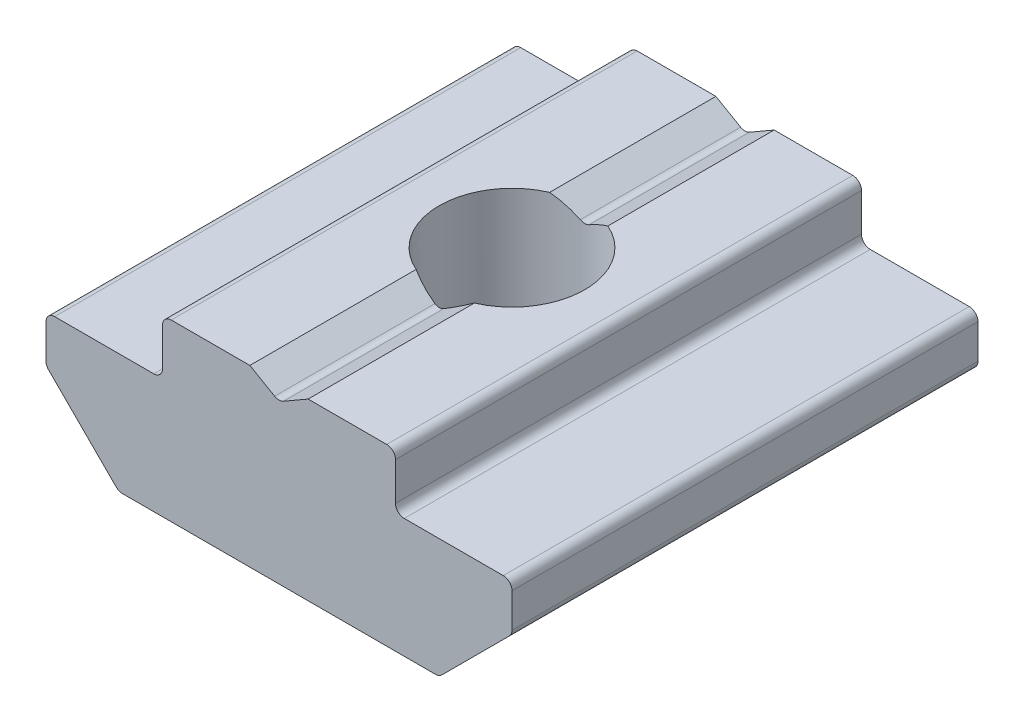
ISO-10303-21;
HEADER;
FILE_DESCRIPTION(('STEP AP214'),'2;1');
FILE_NAME('part.step','',(''),(''),'','','');
FILE_SCHEMA(('AUTOMOTIVE_DESIGN { 1 0 10303 214 1 1 1 1 }'));
ENDSEC;
DATA;
#1=APPLICATION_CONTEXT('core data for automotive mechanical design processes');
#2=APPLICATION_PROTOCOL_DEFINITION('international standard','automotive_design',2000,#1);
#3=PRODUCT_CONTEXT('',#1,'mechanical');
#4=PRODUCT('Part','Part','',(#3));
#5=PRODUCT_RELATED_PRODUCT_CATEGORY('part','',(#4));
#6=PRODUCT_DEFINITION_FORMATION('','',#4);
#7=PRODUCT_DEFINITION_CONTEXT('part definition',#1,'design');
#8=PRODUCT_DEFINITION('design','',#6,#7);
#9=PRODUCT_DEFINITION_SHAPE('','',#8);
#10=(LENGTH_UNIT() NAMED_UNIT(*) SI_UNIT(.MILLI.,.METRE.));
#11=(NAMED_UNIT(*) PLANE_ANGLE_UNIT() SI_UNIT($,.RADIAN.));
#12=(NAMED_UNIT(*) SI_UNIT($,.STERADIAN.) SOLID_ANGLE_UNIT());
#13=UNCERTAINTY_MEASURE_WITH_UNIT(LENGTH_MEASURE(1.E-05),#10,'distance_accuracy_value','');
#14=(GEOMETRIC_REPRESENTATION_CONTEXT(3) GLOBAL_UNCERTAINTY_ASSIGNED_CONTEXT((#13)) GLOBAL_UNIT_ASSIGNED_CONTEXT((#10,
#11,#12)) REPRESENTATION_CONTEXT('',''));
#15=CARTESIAN_POINT('',(0.,0.,0.));
#16=DIRECTION('',(0.,0.,1.));
#17=DIRECTION('',(1.,0.,0.));
#18=AXIS2_PLACEMENT_3D('',#15,#16,#17);
#19=CARTESIAN_POINT('',(0.25,-0.43301270189222,16.));
#20=DIRECTION('',(0.5,-0.866025403784439,0.));
#21=DIRECTION('',(0.866025403784439,0.5,0.));
#22=AXIS2_PLACEMENT_3D('',#19,#20,#21);
#23=PLANE('',#22);
#24=DIRECTION('',(0.,0.,-1.));
#25=VECTOR('',#24,1.);
#26=CARTESIAN_POINT('',(1.,0.,16.));
#27=LINE('',#26,#25);
#28=CARTESIAN_POINT('',(1.,0.,16.));
#29=VERTEX_POINT('',#28);
#30=CARTESIAN_POINT('',(1.,0.,10.2912878474779));
#31=VERTEX_POINT('',#30);
#32=EDGE_CURVE('E313',#29,#31,#27,.T.);
#33=ORIENTED_EDGE('',*,*,#32,.T.);
#34=CARTESIAN_POINT('',(0.,-0.577350269189625,8.));
#35=DIRECTION('',(0.5,-0.866025403784439,0.));
#36=DIRECTION('',(0.866025403784439,0.5,0.));
#37=AXIS2_PLACEMENT_3D('',#34,#35,#36);
#38=ELLIPSE('',#37,2.88675134594813,2.5);
#39=CARTESIAN_POINT('',(0.15,-0.490747728811182,10.4954959426936));
#40=VERTEX_POINT('',#39);
#41=EDGE_CURVE('E400',#31,#40,#38,.T.);
#42=ORIENTED_EDGE('',*,*,#41,.T.);
#43=DIRECTION('',(0.,0.,-1.));
#44=VECTOR('',#43,1.);
#45=CARTESIAN_POINT('',(0.15,-0.490747728811182,16.));
#46=LINE('',#45,#44);
#47=CARTESIAN_POINT('',(0.15,-0.490747728811182,16.));
#48=VERTEX_POINT('',#47);
#49=EDGE_CURVE('E309',#48,#40,#46,.T.);
#50=ORIENTED_EDGE('',*,*,#49,.F.);
#51=DIRECTION('',(-0.866025403784439,-0.5,0.));
#52=VECTOR('',#51,1.);
#53=CARTESIAN_POINT('',(0.25,-0.43301270189222,16.));
#54=LINE('',#53,#52);
#55=EDGE_CURVE('E493',#29,#48,#54,.T.);
#56=ORIENTED_EDGE('',*,*,#55,.F.);
#57=EDGE_LOOP('',(#33,#42,#50,#56));
#58=FACE_BOUND('',#57,.T.);
#59=ADVANCED_FACE('F35',(#58),#23,.F.);
#60=CARTESIAN_POINT('',(0.,-0.23094010767585,16.));
#61=DIRECTION('',(0.,0.,1.));
#62=DIRECTION('',(0.866025403784439,0.5,0.));
#63=AXIS2_PLACEMENT_3D('',#60,#61,#62);
#64=ELLIPSE('',#63,0.300000000000001,0.3);
#65=DIRECTION('',(0.,0.,-1.));
#66=VECTOR('',#65,1.);
#67=SURFACE_OF_LINEAR_EXTRUSION('',#64,#66);
#68=CARTESIAN_POINT('',(0.15,-0.490747728811182,5.50450405730644));
#69=CARTESIAN_POINT('',(0.13568202883733,-0.499029869843911,5.50363835015334));
#70=CARTESIAN_POINT('',(0.120664490923634,-0.50610581903908,5.50286410246527));
#71=CARTESIAN_POINT('',(0.0896672896524015,-0.517700141764689,5.50156180177861));
#72=CARTESIAN_POINT('',(0.0736879123354807,-0.522219271548495,5.50103367599049));
#73=CARTESIAN_POINT('',(0.0412336376802456,-0.528552305885176,5.50028719530378));
#74=CARTESIAN_POINT('',(0.0247600072751891,-0.53037260957326,5.50006810771079));
#75=CARTESIAN_POINT('',(-0.00825823741791211,-0.531280639221926,5.4999591232102));
#76=CARTESIAN_POINT('',(-0.0248028230360078,-0.530369380932977,5.5000691039362));
#77=CARTESIAN_POINT('',(-0.0575073690391814,-0.525838212461767,5.50060843873768));
#78=CARTESIAN_POINT('',(-0.0736673333398581,-0.522218329866565,5.5010377895604));
#79=CARTESIAN_POINT('',(-0.110506856511238,-0.510724691600204,5.50235188429175));
#80=CARTESIAN_POINT('',(-0.130867555440053,-0.501826590966825,5.50334150814386));
#81=CARTESIAN_POINT('',(-0.149999999999997,-0.490747728811184,5.50450405730644));
#82=B_SPLINE_CURVE_WITH_KNOTS('',3,(#68,#69,#70,#71,#72,#73,#74,#75,#76,#77,#78,#79,#80,#81),
.UNSPECIFIED.,.F.,.F.,(4,2,2,2,2,2,4),(0.,0.0496299671329606,0.0992452470817413,
0.14874269599097,0.198221741210452,0.247700282497827,0.313904918598475),.UNSPECIFIED.);
#83=CARTESIAN_POINT('',(0.15,-0.490747728811182,5.50450405730644));
#84=VERTEX_POINT('',#83);
#85=CARTESIAN_POINT('',(-0.150000000000001,-0.490747728811182,5.50450405730644));
#86=VERTEX_POINT('',#85);
#87=EDGE_CURVE('E398',#84,#86,#82,.T.);
#88=ORIENTED_EDGE('',*,*,#87,.F.);
#89=CARTESIAN_POINT('',(0.15,-0.490747728811182,0.));
#90=VERTEX_POINT('',#89);
#91=EDGE_CURVE('E308',#84,#90,#46,.T.);
#92=ORIENTED_EDGE('',*,*,#91,.T.);
#93=CARTESIAN_POINT('',(0.,-0.23094010767585,0.));
#94=DIRECTION('',(0.,0.,1.));
#95=DIRECTION('',(0.866025403784439,0.5,0.));
#96=AXIS2_PLACEMENT_3D('',#93,#94,#95);
#97=ELLIPSE('',#96,0.300000000000001,0.3);
#98=CARTESIAN_POINT('',(-0.150000000000001,-0.490747728811182,0.));
#99=VERTEX_POINT('',#98);
#100=EDGE_CURVE('E357',#99,#90,#97,.T.);
#101=ORIENTED_EDGE('',*,*,#100,.F.);
#102=DIRECTION('',(0.,0.,-1.));
#103=VECTOR('',#102,1.);
#104=CARTESIAN_POINT('',(-0.150000000000001,-0.490747728811182,16.));
#105=LINE('',#104,#103);
#106=EDGE_CURVE('E304',#86,#99,#105,.T.);
#107=ORIENTED_EDGE('',*,*,#106,.F.);
#108=EDGE_LOOP('',(#88,#92,#101,#107));
#109=FACE_BOUND('',#108,.T.);
#110=ADVANCED_FACE('F484',(#109),#67,.T.);
#111=CARTESIAN_POINT('',(-0.250000000000001,-0.43301270189222,16.));
#112=DIRECTION('',(-0.500000000000001,-0.866025403784438,0.));
#113=DIRECTION('',(0.866025403784438,-0.500000000000001,0.));
#114=AXIS2_PLACEMENT_3D('',#111,#112,#113);
#115=PLANE('',#114);
#116=DIRECTION('',(0.,0.,-1.));
#117=VECTOR('',#116,1.);
#118=CARTESIAN_POINT('',(-0.999999999999999,0.,16.));
#119=LINE('',#118,#117);
#120=CARTESIAN_POINT('',(-0.999999999999999,0.,5.70871215252208));
#121=VERTEX_POINT('',#120);
#122=CARTESIAN_POINT('',(-0.999999999999999,0.,0.));
#123=VERTEX_POINT('',#122);
#124=EDGE_CURVE('E300',#121,#123,#119,.T.);
#125=ORIENTED_EDGE('',*,*,#124,.F.);
#126=CARTESIAN_POINT('',(0.,-0.577350269189628,8.));
#127=DIRECTION('',(-0.500000000000001,-0.866025403784438,0.));
#128=DIRECTION('',(-0.866025403784438,0.500000000000001,0.));
#129=AXIS2_PLACEMENT_3D('',#126,#127,#128);
#130=ELLIPSE('',#129,2.88675134594813,2.5);
#131=EDGE_CURVE('E50',#121,#86,#130,.T.);
#132=ORIENTED_EDGE('',*,*,#131,.T.);
#133=ORIENTED_EDGE('',*,*,#106,.T.);
#134=DIRECTION('',(-0.866025403784438,0.500000000000001,0.));
#135=VECTOR('',#134,1.);
#136=CARTESIAN_POINT('',(-0.250000000000001,-0.43301270189222,0.));
#137=LINE('',#136,#135);
#138=EDGE_CURVE('E360',#99,#123,#137,.T.);
#139=ORIENTED_EDGE('',*,*,#138,.T.);
#140=EDGE_LOOP('',(#125,#132,#133,#139));
#141=FACE_BOUND('',#140,.T.);
#142=ADVANCED_FACE('F489',(#141),#115,.F.);
#143=CARTESIAN_POINT('',(8.,0.,16.));
#144=DIRECTION('',(1.,0.,0.));
#145=DIRECTION('',(0.,0.,-1.));
#146=AXIS2_PLACEMENT_3D('',#143,#144,#145);
#147=PLANE('',#146);
#148=DIRECTION('',(0.,-1.,0.));
#149=VECTOR('',#148,1.);
#150=CARTESIAN_POINT('',(8.,0.,0.));
#151=LINE('',#150,#149);
#152=CARTESIAN_POINT('',(8.,-2.2,0.));
#153=VERTEX_POINT('',#152);
#154=CARTESIAN_POINT('',(8.,-3.37573593128807,0.));
#155=VERTEX_POINT('',#154);
#156=EDGE_CURVE('E237',#153,#155,#151,.T.);
#157=ORIENTED_EDGE('',*,*,#156,.F.);
#158=DIRECTION('',(0.,0.,-1.));
#159=VECTOR('',#158,1.);
#160=CARTESIAN_POINT('',(8.,-2.2,16.));
#161=LINE('',#160,#159);
#162=CARTESIAN_POINT('',(8.,-2.2,16.));
#163=VERTEX_POINT('',#162);
#164=EDGE_CURVE('E11',#163,#153,#161,.T.);
#165=ORIENTED_EDGE('',*,*,#164,.F.);
#166=DIRECTION('',(0.,-1.,0.));
#167=VECTOR('',#166,1.);
#168=CARTESIAN_POINT('',(8.,0.,16.));
#169=LINE('',#168,#167);
#170=CARTESIAN_POINT('',(8.,-3.37573593128807,16.));
#171=VERTEX_POINT('',#170);
#172=EDGE_CURVE('E394',#163,#171,#169,.T.);
#173=ORIENTED_EDGE('',*,*,#172,.T.);
#174=DIRECTION('',(0.,0.,-1.));
#175=VECTOR('',#174,1.);
#176=CARTESIAN_POINT('',(8.,-3.37573593128807,16.));
#177=LINE('',#176,#175);
#178=EDGE_CURVE('E140',#171,#155,#177,.T.);
#179=ORIENTED_EDGE('',*,*,#178,.T.);
#180=EDGE_LOOP('',(#157,#165,#173,#179));
#181=FACE_BOUND('',#180,.T.);
#182=ADVANCED_FACE('F37',(#181),#147,.T.);
#183=CARTESIAN_POINT('',(7.7,-2.2,16.));
#184=DIRECTION('',(0.,0.,1.));
#185=DIRECTION('',(1.,0.,0.));
#186=AXIS2_PLACEMENT_3D('',#183,#184,#185);
#187=ELLIPSE('',#186,0.299999999999999,0.299999999999999);
#188=DIRECTION('',(0.,0.,-1.));
#189=VECTOR('',#188,1.);
#190=SURFACE_OF_LINEAR_EXTRUSION('',#187,#189);
#191=CARTESIAN_POINT('',(7.7,-2.2,0.));
#192=DIRECTION('',(0.,0.,1.));
#193=DIRECTION('',(1.,0.,0.));
#194=AXIS2_PLACEMENT_3D('',#191,#192,#193);
#195=ELLIPSE('',#194,0.299999999999999,0.299999999999999);
#196=CARTESIAN_POINT('',(7.7,-1.9,0.));
#197=VERTEX_POINT('',#196);
#198=EDGE_CURVE('E336',#153,#197,#195,.T.);
#199=ORIENTED_EDGE('',*,*,#198,.T.);
#200=DIRECTION('',(0.,0.,-1.));
#201=VECTOR('',#200,1.);
#202=CARTESIAN_POINT('',(7.7,-1.9,16.));
#203=LINE('',#202,#201);
#204=CARTESIAN_POINT('',(7.7,-1.9,16.));
#205=VERTEX_POINT('',#204);
#206=EDGE_CURVE('E43',#205,#197,#203,.T.);
#207=ORIENTED_EDGE('',*,*,#206,.F.);
#208=EDGE_CURVE('E444',#163,#205,#187,.T.);
#209=ORIENTED_EDGE('',*,*,#208,.F.);
#210=ORIENTED_EDGE('',*,*,#164,.T.);
#211=EDGE_LOOP('',(#199,#207,#209,#210));
#212=FACE_BOUND('',#211,.T.);
#213=ADVANCED_FACE('F337',(#212),#190,.F.);
#214=CARTESIAN_POINT('',(0.,-1.9,16.));
#215=DIRECTION('',(0.,1.,0.));
#216=DIRECTION('',(-1.,0.,0.));
#217=AXIS2_PLACEMENT_3D('',#214,#215,#216);
#218=PLANE('',#217);
#219=DIRECTION('',(1.,0.,0.));
#220=VECTOR('',#219,1.);
#221=CARTESIAN_POINT('',(0.,-1.9,0.));
#222=LINE('',#221,#220);
#223=CARTESIAN_POINT('',(4.3,-1.9,0.));
#224=VERTEX_POINT('',#223);
#225=EDGE_CURVE('E330',#224,#197,#222,.T.);
#226=ORIENTED_EDGE('',*,*,#225,.F.);
#227=DIRECTION('',(0.,0.,-1.));
#228=VECTOR('',#227,1.);
#229=CARTESIAN_POINT('',(4.3,-1.9,16.));
#230=LINE('',#229,#228);
#231=CARTESIAN_POINT('',(4.3,-1.9,16.));
#232=VERTEX_POINT('',#231);
#233=EDGE_CURVE('E322',#232,#224,#230,.T.);
#234=ORIENTED_EDGE('',*,*,#233,.F.);
#235=DIRECTION('',(1.,0.,0.));
#236=VECTOR('',#235,1.);
#237=CARTESIAN_POINT('',(0.,-1.9,16.));
#238=LINE('',#237,#236);
#239=EDGE_CURVE('E333',#232,#205,#238,.T.);
#240=ORIENTED_EDGE('',*,*,#239,.T.);
#241=ORIENTED_EDGE('',*,*,#206,.T.);
#242=EDGE_LOOP('',(#226,#234,#240,#241));
#243=FACE_BOUND('',#242,.T.);
#244=ADVANCED_FACE('F328',(#243),#218,.T.);
#245=CARTESIAN_POINT('',(4.3,-1.6,16.));
#246=DIRECTION('',(0.,0.,1.));
#247=DIRECTION('',(0.,1.,0.));
#248=AXIS2_PLACEMENT_3D('',#245,#246,#247);
#249=ELLIPSE('',#248,0.299999999999999,0.299999999999999);
#250=DIRECTION('',(0.,0.,-1.));
#251=VECTOR('',#250,1.);
#252=SURFACE_OF_LINEAR_EXTRUSION('',#249,#251);
#253=CARTESIAN_POINT('',(4.3,-1.6,0.));
#254=DIRECTION('',(0.,0.,1.));
#255=DIRECTION('',(0.,1.,0.));
#256=AXIS2_PLACEMENT_3D('',#253,#254,#255);
#257=ELLIPSE('',#256,0.299999999999999,0.299999999999999);
#258=CARTESIAN_POINT('',(4.,-1.6,0.));
#259=VERTEX_POINT('',#258);
#260=EDGE_CURVE('E342',#259,#224,#257,.T.);
#261=ORIENTED_EDGE('',*,*,#260,.F.);
#262=DIRECTION('',(0.,0.,-1.));
#263=VECTOR('',#262,1.);
#264=CARTESIAN_POINT('',(4.,-1.6,16.));
#265=LINE('',#264,#263);
#266=CARTESIAN_POINT('',(4.,-1.6,16.));
#267=VERTEX_POINT('',#266);
#268=EDGE_CURVE('E320',#267,#259,#265,.T.);
#269=ORIENTED_EDGE('',*,*,#268,.F.);
#270=EDGE_CURVE('E458',#267,#232,#249,.T.);
#271=ORIENTED_EDGE('',*,*,#270,.T.);
#272=ORIENTED_EDGE('',*,*,#233,.T.);
#273=EDGE_LOOP('',(#261,#269,#271,#272));
#274=FACE_BOUND('',#273,.T.);
#275=ADVANCED_FACE('F452',(#274),#252,.T.);
#276=CARTESIAN_POINT('',(4.,0.,16.));
#277=DIRECTION('',(1.,0.,0.));
#278=DIRECTION('',(0.,0.,-1.));
#279=AXIS2_PLACEMENT_3D('',#276,#277,#278);
#280=PLANE('',#279);
#281=DIRECTION('',(0.,-1.,0.));
#282=VECTOR('',#281,1.);
#283=CARTESIAN_POINT('',(4.,0.,0.));
#284=LINE('',#283,#282);
#285=CARTESIAN_POINT('',(4.,-0.3,0.));
#286=VERTEX_POINT('',#285);
#287=EDGE_CURVE('E344',#286,#259,#284,.T.);
#288=ORIENTED_EDGE('',*,*,#287,.F.);
#289=DIRECTION('',(0.,0.,-1.));
#290=VECTOR('',#289,1.);
#291=CARTESIAN_POINT('',(4.,-0.3,16.));
#292=LINE('',#291,#290);
#293=CARTESIAN_POINT('',(4.,-0.3,16.));
#294=VERTEX_POINT('',#293);
#295=EDGE_CURVE('E318',#294,#286,#292,.T.);
#296=ORIENTED_EDGE('',*,*,#295,.F.);
#297=DIRECTION('',(0.,-1.,0.));
#298=VECTOR('',#297,1.);
#299=CARTESIAN_POINT('',(4.,0.,16.));
#300=LINE('',#299,#298);
#301=EDGE_CURVE('E462',#294,#267,#300,.T.);
#302=ORIENTED_EDGE('',*,*,#301,.T.);
#303=ORIENTED_EDGE('',*,*,#268,.T.);
#304=EDGE_LOOP('',(#288,#296,#302,#303));
#305=FACE_BOUND('',#304,.T.);
#306=ADVANCED_FACE('F455',(#305),#280,.T.);
#307=CARTESIAN_POINT('',(3.7,-0.299999999999999,16.));
#308=DIRECTION('',(0.,0.,1.));
#309=DIRECTION('',(1.,0.,0.));
#310=AXIS2_PLACEMENT_3D('',#307,#308,#309);
#311=ELLIPSE('',#310,0.299999999999999,0.299999999999999);
#312=DIRECTION('',(0.,0.,-1.));
#313=VECTOR('',#312,1.);
#314=SURFACE_OF_LINEAR_EXTRUSION('',#311,#313);
#315=CARTESIAN_POINT('',(3.7,-0.299999999999999,0.));
#316=DIRECTION('',(0.,0.,1.));
#317=DIRECTION('',(1.,0.,0.));
#318=AXIS2_PLACEMENT_3D('',#315,#316,#317);
#319=ELLIPSE('',#318,0.299999999999999,0.299999999999999);
#320=CARTESIAN_POINT('',(3.7,0.,0.));
#321=VERTEX_POINT('',#320);
#322=EDGE_CURVE('E348',#286,#321,#319,.T.);
#323=ORIENTED_EDGE('',*,*,#322,.T.);
#324=DIRECTION('',(0.,0.,-1.));
#325=VECTOR('',#324,1.);
#326=CARTESIAN_POINT('',(3.7,0.,16.));
#327=LINE('',#326,#325);
#328=CARTESIAN_POINT('',(3.7,0.,16.));
#329=VERTEX_POINT('',#328);
#330=EDGE_CURVE('E316',#329,#321,#327,.T.);
#331=ORIENTED_EDGE('',*,*,#330,.F.);
#332=EDGE_CURVE('E465',#294,#329,#311,.T.);
#333=ORIENTED_EDGE('',*,*,#332,.F.);
#334=ORIENTED_EDGE('',*,*,#295,.T.);
#335=EDGE_LOOP('',(#323,#331,#333,#334));
#336=FACE_BOUND('',#335,.T.);
#337=ADVANCED_FACE('F470',(#336),#314,.F.);
#338=CARTESIAN_POINT('',(0.,0.,16.));
#339=DIRECTION('',(0.,1.,0.));
#340=DIRECTION('',(-1.,0.,0.));
#341=AXIS2_PLACEMENT_3D('',#338,#339,#340);
#342=PLANE('',#341);
#343=CARTESIAN_POINT('',(0.,0.,8.));
#344=DIRECTION('',(0.,1.,0.));
#345=DIRECTION('',(-1.,0.,0.));
#346=AXIS2_PLACEMENT_3D('',#343,#344,#345);
#347=CIRCLE('',#346,2.5);
#348=CARTESIAN_POINT('',(1.,0.,5.70871215252208));
#349=VERTEX_POINT('',#348);
#350=EDGE_CURVE('E500',#31,#349,#347,.T.);
#351=ORIENTED_EDGE('',*,*,#350,.F.);
#352=ORIENTED_EDGE('',*,*,#32,.F.);
#353=DIRECTION('',(1.,0.,0.));
#354=VECTOR('',#353,1.);
#355=CARTESIAN_POINT('',(0.,0.,16.));
#356=LINE('',#355,#354);
#357=EDGE_CURVE('E468',#29,#329,#356,.T.);
#358=ORIENTED_EDGE('',*,*,#357,.T.);
#359=ORIENTED_EDGE('',*,*,#330,.T.);
#360=DIRECTION('',(1.,0.,0.));
#361=VECTOR('',#360,1.);
#362=CARTESIAN_POINT('',(0.,0.,0.));
#363=LINE('',#362,#361);
#364=CARTESIAN_POINT('',(1.,0.,0.));
#365=VERTEX_POINT('',#364);
#366=EDGE_CURVE('E351',#365,#321,#363,.T.);
#367=ORIENTED_EDGE('',*,*,#366,.F.);
#368=EDGE_CURVE('E312',#349,#365,#27,.T.);
#369=ORIENTED_EDGE('',*,*,#368,.F.);
#370=EDGE_LOOP('',(#351,#352,#358,#359,#367,#369));
#371=FACE_BOUND('',#370,.T.);
#372=ADVANCED_FACE('F473',(#371),#342,.T.);
#373=ORIENTED_EDGE('',*,*,#91,.F.);
#374=EDGE_CURVE('E396',#84,#349,#38,.T.);
#375=ORIENTED_EDGE('',*,*,#374,.T.);
#376=ORIENTED_EDGE('',*,*,#368,.T.);
#377=DIRECTION('',(-0.866025403784439,-0.5,0.));
#378=VECTOR('',#377,1.);
#379=CARTESIAN_POINT('',(0.25,-0.43301270189222,0.));
#380=LINE('',#379,#378);
#381=EDGE_CURVE('E354',#365,#90,#380,.T.);
#382=ORIENTED_EDGE('',*,*,#381,.T.);
#383=EDGE_LOOP('',(#373,#375,#376,#382));
#384=FACE_BOUND('',#383,.T.);
#385=ADVANCED_FACE('F476',(#384),#23,.F.);
#386=CARTESIAN_POINT('',(-0.150000000000001,-0.490747728811182,10.4954959426936));
#387=CARTESIAN_POINT('',(-0.135682028837331,-0.499029869843911,10.4963616498467));
#388=CARTESIAN_POINT('',(-0.120664490923635,-0.50610581903908,10.4971358975347));
#389=CARTESIAN_POINT('',(-0.0896672896524024,-0.517700141764689,10.4984381982214));
#390=CARTESIAN_POINT('',(-0.0736879123354816,-0.522219271548495,10.4989663240095));
#391=CARTESIAN_POINT('',(-0.0412336376802464,-0.528552305885176,10.4997128046962));
#392=CARTESIAN_POINT('',(-0.0247600072751899,-0.53037260957326,10.4999318922892));
#393=CARTESIAN_POINT('',(0.00825823741791129,-0.531280639221926,10.5000408767898));
#394=CARTESIAN_POINT('',(0.024802823036007,-0.530369380932977,10.4999308960638));
#395=CARTESIAN_POINT('',(0.0575073690391806,-0.525838212461767,10.4993915612623));
#396=CARTESIAN_POINT('',(0.0736673333398574,-0.522218329866565,10.4989622104396));
#397=CARTESIAN_POINT('',(0.110506856511238,-0.510724691600204,10.4976481157082));
#398=CARTESIAN_POINT('',(0.130867555440052,-0.501826590966825,10.4966584918561));
#399=CARTESIAN_POINT('',(0.149999999999997,-0.490747728811184,10.4954959426936));
#400=B_SPLINE_CURVE_WITH_KNOTS('',3,(#386,#387,#388,#389,#390,#391,#392,#393,#394,#395,#396,
#397,#398,#399),.UNSPECIFIED.,.F.,.F.,(4,2,2,2,2,2,4),(0.,0.0496299671329606,0.0992452470817415,
0.14874269599097,0.198221741210452,0.247700282497827,0.313904918598476),.UNSPECIFIED.);
#401=CARTESIAN_POINT('',(-0.150000000000001,-0.490747728811182,10.4954959426936));
#402=VERTEX_POINT('',#401);
#403=EDGE_CURVE('E409',#402,#40,#400,.T.);
#404=ORIENTED_EDGE('',*,*,#403,.F.);
#405=CARTESIAN_POINT('',(-0.150000000000001,-0.490747728811182,16.));
#406=VERTEX_POINT('',#405);
#407=EDGE_CURVE('E305',#406,#402,#105,.T.);
#408=ORIENTED_EDGE('',*,*,#407,.F.);
#409=EDGE_CURVE('E522',#406,#48,#64,.T.);
#410=ORIENTED_EDGE('',*,*,#409,.T.);
#411=ORIENTED_EDGE('',*,*,#49,.T.);
#412=EDGE_LOOP('',(#404,#408,#410,#411));
#413=FACE_BOUND('',#412,.T.);
#414=ADVANCED_FACE('F428',(#413),#67,.T.);
#415=ORIENTED_EDGE('',*,*,#407,.T.);
#416=CARTESIAN_POINT('',(-0.999999999999999,0.,10.2912878474779));
#417=VERTEX_POINT('',#416);
#418=EDGE_CURVE('E415',#402,#417,#130,.T.);
#419=ORIENTED_EDGE('',*,*,#418,.T.);
#420=CARTESIAN_POINT('',(-0.999999999999999,0.,16.));
#421=VERTEX_POINT('',#420);
#422=EDGE_CURVE('E301',#421,#417,#119,.T.);
#423=ORIENTED_EDGE('',*,*,#422,.F.);
#424=DIRECTION('',(-0.866025403784438,0.500000000000001,0.));
#425=VECTOR('',#424,1.);
#426=CARTESIAN_POINT('',(-0.250000000000001,-0.43301270189222,16.));
#427=LINE('',#426,#425);
#428=EDGE_CURVE('E518',#406,#421,#427,.T.);
#429=ORIENTED_EDGE('',*,*,#428,.F.);
#430=EDGE_LOOP('',(#415,#419,#423,#429));
#431=FACE_BOUND('',#430,.T.);
#432=ADVANCED_FACE('F482',(#431),#115,.F.);
#433=CARTESIAN_POINT('',(0.,0.,16.));
#434=DIRECTION('',(0.,-1.,0.));
#435=DIRECTION('',(1.,0.,0.));
#436=AXIS2_PLACEMENT_3D('',#433,#434,#435);
#437=PLANE('',#436);
#438=ORIENTED_EDGE('',*,*,#422,.T.);
#439=EDGE_CURVE('E502',#121,#417,#347,.T.);
#440=ORIENTED_EDGE('',*,*,#439,.F.);
#441=ORIENTED_EDGE('',*,*,#124,.T.);
#442=DIRECTION('',(-1.,0.,0.));
#443=VECTOR('',#442,1.);
#444=CARTESIAN_POINT('',(0.,0.,0.));
#445=LINE('',#444,#443);
#446=CARTESIAN_POINT('',(-3.7,0.,0.));
#447=VERTEX_POINT('',#446);
#448=EDGE_CURVE('E363',#123,#447,#445,.T.);
#449=ORIENTED_EDGE('',*,*,#448,.T.);
#450=DIRECTION('',(0.,0.,-1.));
#451=VECTOR('',#450,1.);
#452=CARTESIAN_POINT('',(-3.7,0.,16.));
#453=LINE('',#452,#451);
#454=CARTESIAN_POINT('',(-3.7,0.,16.));
#455=VERTEX_POINT('',#454);
#456=EDGE_CURVE('E297',#455,#447,#453,.T.);
#457=ORIENTED_EDGE('',*,*,#456,.F.);
#458=DIRECTION('',(-1.,0.,0.));
#459=VECTOR('',#458,1.);
#460=CARTESIAN_POINT('',(0.,0.,16.));
#461=LINE('',#460,#459);
#462=EDGE_CURVE('E515',#421,#455,#461,.T.);
#463=ORIENTED_EDGE('',*,*,#462,.F.);
#464=EDGE_LOOP('',(#438,#440,#441,#449,#457,#463));
#465=FACE_BOUND('',#464,.T.);
#466=ADVANCED_FACE('F513',(#465),#437,.F.);
#467=CARTESIAN_POINT('',(-3.7,-0.299999999999999,16.));
#468=DIRECTION('',(0.,0.,1.));
#469=DIRECTION('',(-1.,0.,0.));
#470=AXIS2_PLACEMENT_3D('',#467,#468,#469);
#471=ELLIPSE('',#470,0.299999999999999,0.299999999999999);
#472=DIRECTION('',(0.,0.,-1.));
#473=VECTOR('',#472,1.);
#474=SURFACE_OF_LINEAR_EXTRUSION('',#471,#473);
#475=CARTESIAN_POINT('',(-3.7,-0.299999999999999,0.));
#476=DIRECTION('',(0.,0.,1.));
#477=DIRECTION('',(-1.,0.,0.));
#478=AXIS2_PLACEMENT_3D('',#475,#476,#477);
#479=ELLIPSE('',#478,0.299999999999999,0.299999999999999);
#480=CARTESIAN_POINT('',(-4.,-0.3,0.));
#481=VERTEX_POINT('',#480);
#482=EDGE_CURVE('E365',#447,#481,#479,.T.);
#483=ORIENTED_EDGE('',*,*,#482,.T.);
#484=DIRECTION('',(0.,0.,-1.));
#485=VECTOR('',#484,1.);
#486=CARTESIAN_POINT('',(-4.,-0.3,16.));
#487=LINE('',#486,#485);
#488=CARTESIAN_POINT('',(-4.,-0.3,16.));
#489=VERTEX_POINT('',#488);
#490=EDGE_CURVE('E294',#489,#481,#487,.T.);
#491=ORIENTED_EDGE('',*,*,#490,.F.);
#492=EDGE_CURVE('E517',#455,#489,#471,.T.);
#493=ORIENTED_EDGE('',*,*,#492,.F.);
#494=ORIENTED_EDGE('',*,*,#456,.T.);
#495=EDGE_LOOP('',(#483,#491,#493,#494));
#496=FACE_BOUND('',#495,.T.);
#497=ADVANCED_FACE('F528',(#496),#474,.F.);
#498=CARTESIAN_POINT('',(-4.,0.,16.));
#499=DIRECTION('',(1.,0.,0.));
#500=DIRECTION('',(0.,0.,-1.));
#501=AXIS2_PLACEMENT_3D('',#498,#499,#500);
#502=PLANE('',#501);
#503=DIRECTION('',(0.,-1.,0.));
#504=VECTOR('',#503,1.);
#505=CARTESIAN_POINT('',(-4.,0.,0.));
#506=LINE('',#505,#504);
#507=CARTESIAN_POINT('',(-4.,-1.6,0.));
#508=VERTEX_POINT('',#507);
#509=EDGE_CURVE('E367',#481,#508,#506,.T.);
#510=ORIENTED_EDGE('',*,*,#509,.T.);
#511=DIRECTION('',(0.,0.,-1.));
#512=VECTOR('',#511,1.);
#513=CARTESIAN_POINT('',(-4.,-1.6,16.));
#514=LINE('',#513,#512);
#515=CARTESIAN_POINT('',(-4.,-1.6,16.));
#516=VERTEX_POINT('',#515);
#517=EDGE_CURVE('E292',#516,#508,#514,.T.);
#518=ORIENTED_EDGE('',*,*,#517,.F.);
#519=DIRECTION('',(0.,-1.,0.));
#520=VECTOR('',#519,1.);
#521=CARTESIAN_POINT('',(-4.,0.,16.));
#522=LINE('',#521,#520);
#523=EDGE_CURVE('E520',#489,#516,#522,.T.);
#524=ORIENTED_EDGE('',*,*,#523,.F.);
#525=ORIENTED_EDGE('',*,*,#490,.T.);
#526=EDGE_LOOP('',(#510,#518,#524,#525));
#527=FACE_BOUND('',#526,.T.);
#528=ADVANCED_FACE('F532',(#527),#502,.F.);
#529=CARTESIAN_POINT('',(-4.3,-1.6,16.));
#530=DIRECTION('',(0.,0.,1.));
#531=DIRECTION('',(1.,0.,0.));
#532=AXIS2_PLACEMENT_3D('',#529,#530,#531);
#533=ELLIPSE('',#532,0.300000000000001,0.300000000000001);
#534=DIRECTION('',(0.,0.,-1.));
#535=VECTOR('',#534,1.);
#536=SURFACE_OF_LINEAR_EXTRUSION('',#533,#535);
#537=CARTESIAN_POINT('',(-4.3,-1.6,0.));
#538=DIRECTION('',(0.,0.,1.));
#539=DIRECTION('',(1.,0.,0.));
#540=AXIS2_PLACEMENT_3D('',#537,#538,#539);
#541=ELLIPSE('',#540,0.300000000000001,0.300000000000001);
#542=CARTESIAN_POINT('',(-4.3,-1.9,0.));
#543=VERTEX_POINT('',#542);
#544=EDGE_CURVE('E370',#543,#508,#541,.T.);
#545=ORIENTED_EDGE('',*,*,#544,.F.);
#546=DIRECTION('',(0.,0.,-1.));
#547=VECTOR('',#546,1.);
#548=CARTESIAN_POINT('',(-4.3,-1.9,16.));
#549=LINE('',#548,#547);
#550=CARTESIAN_POINT('',(-4.3,-1.9,16.));
#551=VERTEX_POINT('',#550);
#552=EDGE_CURVE('E290',#551,#543,#549,.T.);
#553=ORIENTED_EDGE('',*,*,#552,.F.);
#554=EDGE_CURVE('E557',#551,#516,#533,.T.);
#555=ORIENTED_EDGE('',*,*,#554,.T.);
#556=ORIENTED_EDGE('',*,*,#517,.T.);
#557=EDGE_LOOP('',(#545,#553,#555,#556));
#558=FACE_BOUND('',#557,.T.);
#559=ADVANCED_FACE('F565',(#558),#536,.T.);
#560=CARTESIAN_POINT('',(0.,-1.9,16.));
#561=DIRECTION('',(0.,1.,0.));
#562=DIRECTION('',(-1.,0.,0.));
#563=AXIS2_PLACEMENT_3D('',#560,#561,#562);
#564=PLANE('',#563);
#565=DIRECTION('',(1.,0.,0.));
#566=VECTOR('',#565,1.);
#567=CARTESIAN_POINT('',(0.,-1.9,0.));
#568=LINE('',#567,#566);
#569=CARTESIAN_POINT('',(-7.7,-1.9,0.));
#570=VERTEX_POINT('',#569);
#571=EDGE_CURVE('E373',#570,#543,#568,.T.);
#572=ORIENTED_EDGE('',*,*,#571,.F.);
#573=DIRECTION('',(0.,0.,-1.));
#574=VECTOR('',#573,1.);
#575=CARTESIAN_POINT('',(-7.7,-1.9,16.));
#576=LINE('',#575,#574);
#577=CARTESIAN_POINT('',(-7.7,-1.9,16.));
#578=VERTEX_POINT('',#577);
#579=EDGE_CURVE('E288',#578,#570,#576,.T.);
#580=ORIENTED_EDGE('',*,*,#579,.F.);
#581=DIRECTION('',(1.,0.,0.));
#582=VECTOR('',#581,1.);
#583=CARTESIAN_POINT('',(0.,-1.9,16.));
#584=LINE('',#583,#582);
#585=EDGE_CURVE('E558',#578,#551,#584,.T.);
#586=ORIENTED_EDGE('',*,*,#585,.T.);
#587=ORIENTED_EDGE('',*,*,#552,.T.);
#588=EDGE_LOOP('',(#572,#580,#586,#587));
#589=FACE_BOUND('',#588,.T.);
#590=ADVANCED_FACE('F568',(#589),#564,.T.);
#591=CARTESIAN_POINT('',(-7.7,-2.2,16.));
#592=DIRECTION('',(0.,0.,1.));
#593=DIRECTION('',(1.,0.,0.));
#594=AXIS2_PLACEMENT_3D('',#591,#592,#593);
#595=ELLIPSE('',#594,0.3,0.299999999999999);
#596=DIRECTION('',(0.,0.,-1.));
#597=VECTOR('',#596,1.);
#598=SURFACE_OF_LINEAR_EXTRUSION('',#595,#597);
#599=CARTESIAN_POINT('',(-7.7,-2.2,0.));
#600=DIRECTION('',(0.,0.,1.));
#601=DIRECTION('',(1.,0.,0.));
#602=AXIS2_PLACEMENT_3D('',#599,#600,#601);
#603=ELLIPSE('',#602,0.3,0.299999999999999);
#604=CARTESIAN_POINT('',(-8.,-2.2,0.));
#605=VERTEX_POINT('',#604);
#606=EDGE_CURVE('E376',#570,#605,#603,.T.);
#607=ORIENTED_EDGE('',*,*,#606,.T.);
#608=DIRECTION('',(0.,0.,-1.));
#609=VECTOR('',#608,1.);
#610=CARTESIAN_POINT('',(-8.,-2.2,16.));
#611=LINE('',#610,#609);
#612=CARTESIAN_POINT('',(-8.,-2.2,16.));
#613=VERTEX_POINT('',#612);
#614=EDGE_CURVE('E286',#613,#605,#611,.T.);
#615=ORIENTED_EDGE('',*,*,#614,.F.);
#616=EDGE_CURVE('E561',#578,#613,#595,.T.);
#617=ORIENTED_EDGE('',*,*,#616,.F.);
#618=ORIENTED_EDGE('',*,*,#579,.T.);
#619=EDGE_LOOP('',(#607,#615,#617,#618));
#620=FACE_BOUND('',#619,.T.);
#621=ADVANCED_FACE('F571',(#620),#598,.F.);
#622=CARTESIAN_POINT('',(-8.,0.,16.));
#623=DIRECTION('',(-1.,0.,0.));
#624=DIRECTION('',(0.,0.,1.));
#625=AXIS2_PLACEMENT_3D('',#622,#623,#624);
#626=PLANE('',#625);
#627=DIRECTION('',(0.,1.,0.));
#628=VECTOR('',#627,1.);
#629=CARTESIAN_POINT('',(-8.,0.,0.));
#630=LINE('',#629,#628);
#631=CARTESIAN_POINT('',(-8.,-3.37573593128807,0.));
#632=VERTEX_POINT('',#631);
#633=EDGE_CURVE('E379',#632,#605,#630,.T.);
#634=ORIENTED_EDGE('',*,*,#633,.F.);
#635=DIRECTION('',(0.,0.,-1.));
#636=VECTOR('',#635,1.);
#637=CARTESIAN_POINT('',(-8.,-3.37573593128807,16.));
#638=LINE('',#637,#636);
#639=CARTESIAN_POINT('',(-8.,-3.37573593128807,16.));
#640=VERTEX_POINT('',#639);
#641=EDGE_CURVE('E284',#640,#632,#638,.T.);
#642=ORIENTED_EDGE('',*,*,#641,.F.);
#643=DIRECTION('',(0.,1.,0.));
#644=VECTOR('',#643,1.);
#645=CARTESIAN_POINT('',(-8.,0.,16.));
#646=LINE('',#645,#644);
#647=EDGE_CURVE('E579',#640,#613,#646,.T.);
#648=ORIENTED_EDGE('',*,*,#647,.T.);
#649=ORIENTED_EDGE('',*,*,#614,.T.);
#650=EDGE_LOOP('',(#634,#642,#648,#649));
#651=FACE_BOUND('',#650,.T.);
#652=ADVANCED_FACE('F575',(#651),#626,.T.);
#653=CARTESIAN_POINT('',(-7.7,-3.37573593128807,16.));
#654=DIRECTION('',(0.,0.,1.));
#655=DIRECTION('',(-1.,0.,0.));
#656=AXIS2_PLACEMENT_3D('',#653,#654,#655);
#657=ELLIPSE('',#656,0.299999999999996,0.299999999999995);
#658=DIRECTION('',(0.,0.,-1.));
#659=VECTOR('',#658,1.);
#660=SURFACE_OF_LINEAR_EXTRUSION('',#657,#659);
#661=CARTESIAN_POINT('',(-7.7,-3.37573593128807,0.));
#662=DIRECTION('',(0.,0.,1.));
#663=DIRECTION('',(-1.,0.,0.));
#664=AXIS2_PLACEMENT_3D('',#661,#662,#663);
#665=ELLIPSE('',#664,0.299999999999996,0.299999999999995);
#666=CARTESIAN_POINT('',(-7.91213203435596,-3.58786796564403,0.));
#667=VERTEX_POINT('',#666);
#668=EDGE_CURVE('E382',#632,#667,#665,.T.);
#669=ORIENTED_EDGE('',*,*,#668,.T.);
#670=DIRECTION('',(0.,0.,-1.));
#671=VECTOR('',#670,1.);
#672=CARTESIAN_POINT('',(-7.91213203435596,-3.58786796564403,16.));
#673=LINE('',#672,#671);
#674=CARTESIAN_POINT('',(-7.91213203435596,-3.58786796564403,16.));
#675=VERTEX_POINT('',#674);
#676=EDGE_CURVE('E281',#675,#667,#673,.T.);
#677=ORIENTED_EDGE('',*,*,#676,.F.);
#678=EDGE_CURVE('E581',#640,#675,#657,.T.);
#679=ORIENTED_EDGE('',*,*,#678,.F.);
#680=ORIENTED_EDGE('',*,*,#641,.T.);
#681=EDGE_LOOP('',(#669,#677,#679,#680));
#682=FACE_BOUND('',#681,.T.);
#683=ADVANCED_FACE('F583',(#682),#660,.F.);
#684=CARTESIAN_POINT('',(-5.75000000000001,-5.74999999999999,16.));
#685=DIRECTION('',(0.707106781186549,0.707106781186547,0.));
#686=DIRECTION('',(-0.707106781186547,0.707106781186549,0.));
#687=AXIS2_PLACEMENT_3D('',#684,#685,#686);
#688=PLANE('',#687);
#689=DIRECTION('',(0.707106781186547,-0.707106781186549,0.));
#690=VECTOR('',#689,1.);
#691=CARTESIAN_POINT('',(-5.75000000000001,-5.74999999999999,0.));
#692=LINE('',#691,#690);
#693=CARTESIAN_POINT('',(-5.58786796564404,-5.91213203435596,0.));
#694=VERTEX_POINT('',#693);
#695=EDGE_CURVE('E384',#667,#694,#692,.T.);
#696=ORIENTED_EDGE('',*,*,#695,.T.);
#697=DIRECTION('',(0.,0.,-1.));
#698=VECTOR('',#697,1.);
#699=CARTESIAN_POINT('',(-5.58786796564404,-5.91213203435596,16.));
#700=LINE('',#699,#698);
#701=CARTESIAN_POINT('',(-5.58786796564404,-5.91213203435596,16.));
#702=VERTEX_POINT('',#701);
#703=EDGE_CURVE('E275',#702,#694,#700,.T.);
#704=ORIENTED_EDGE('',*,*,#703,.F.);
#705=DIRECTION('',(0.707106781186547,-0.707106781186549,0.));
#706=VECTOR('',#705,1.);
#707=CARTESIAN_POINT('',(-5.75000000000001,-5.74999999999999,16.));
#708=LINE('',#707,#706);
#709=EDGE_CURVE('E265',#675,#702,#708,.T.);
#710=ORIENTED_EDGE('',*,*,#709,.F.);
#711=ORIENTED_EDGE('',*,*,#676,.T.);
#712=EDGE_LOOP('',(#696,#704,#710,#711));
#713=FACE_BOUND('',#712,.T.);
#714=ADVANCED_FACE('F259',(#713),#688,.F.);
#715=CARTESIAN_POINT('',(-5.37573593128807,-5.7,16.));
#716=DIRECTION('',(0.,0.,1.));
#717=DIRECTION('',(-0.707106781186549,-0.707106781186546,0.));
#718=AXIS2_PLACEMENT_3D('',#715,#716,#717);
#719=ELLIPSE('',#718,0.3,0.3);
#720=DIRECTION('',(0.,0.,-1.));
#721=VECTOR('',#720,1.);
#722=SURFACE_OF_LINEAR_EXTRUSION('',#719,#721);
#723=CARTESIAN_POINT('',(-5.37573593128807,-5.7,0.));
#724=DIRECTION('',(0.,0.,1.));
#725=DIRECTION('',(-0.707106781186549,-0.707106781186546,0.));
#726=AXIS2_PLACEMENT_3D('',#723,#724,#725);
#727=ELLIPSE('',#726,0.3,0.3);
#728=CARTESIAN_POINT('',(-5.37573593128807,-6.,0.));
#729=VERTEX_POINT('',#728);
#730=EDGE_CURVE('E386',#694,#729,#727,.T.);
#731=ORIENTED_EDGE('',*,*,#730,.T.);
#732=DIRECTION('',(0.,0.,-1.));
#733=VECTOR('',#732,1.);
#734=CARTESIAN_POINT('',(-5.37573593128807,-6.,16.));
#735=LINE('',#734,#733);
#736=CARTESIAN_POINT('',(-5.37573593128807,-6.,16.));
#737=VERTEX_POINT('',#736);
#738=EDGE_CURVE('E270',#737,#729,#735,.T.);
#739=ORIENTED_EDGE('',*,*,#738,.F.);
#740=EDGE_CURVE('E262',#702,#737,#719,.T.);
#741=ORIENTED_EDGE('',*,*,#740,.F.);
#742=ORIENTED_EDGE('',*,*,#703,.T.);
#743=EDGE_LOOP('',(#731,#739,#741,#742));
#744=FACE_BOUND('',#743,.T.);
#745=ADVANCED_FACE('F254',(#744),#722,.F.);
#746=CARTESIAN_POINT('',(0.,-6.,16.));
#747=DIRECTION('',(0.,-1.,0.));
#748=DIRECTION('',(0.,0.,-1.));
#749=AXIS2_PLACEMENT_3D('',#746,#747,#748);
#750=PLANE('',#749);
#751=CARTESIAN_POINT('',(0.,-6.,8.));
#752=DIRECTION('',(0.,1.,0.));
#753=DIRECTION('',(-1.,0.,0.));
#754=AXIS2_PLACEMENT_3D('',#751,#752,#753);
#755=CIRCLE('',#754,2.5);
#756=CARTESIAN_POINT('',(-2.5,-6.,8.));
#757=VERTEX_POINT('',#756);
#758=EDGE_CURVE('E420',#757,#757,#755,.T.);
#759=ORIENTED_EDGE('',*,*,#758,.T.);
#760=EDGE_LOOP('',(#759));
#761=FACE_BOUND('',#760,.T.);
#762=DIRECTION('',(-1.,0.,0.));
#763=VECTOR('',#762,1.);
#764=CARTESIAN_POINT('',(0.,-6.,0.));
#765=LINE('',#764,#763);
#766=CARTESIAN_POINT('',(5.37573593128808,-6.,0.));
#767=VERTEX_POINT('',#766);
#768=EDGE_CURVE('E273',#767,#729,#765,.T.);
#769=ORIENTED_EDGE('',*,*,#768,.F.);
#770=DIRECTION('',(0.,0.,-1.));
#771=VECTOR('',#770,1.);
#772=CARTESIAN_POINT('',(5.37573593128808,-6.,16.));
#773=LINE('',#772,#771);
#774=CARTESIAN_POINT('',(5.37573593128808,-6.,16.));
#775=VERTEX_POINT('',#774);
#776=EDGE_CURVE('E227',#775,#767,#773,.T.);
#777=ORIENTED_EDGE('',*,*,#776,.F.);
#778=DIRECTION('',(-1.,0.,0.));
#779=VECTOR('',#778,1.);
#780=CARTESIAN_POINT('',(0.,-6.,16.));
#781=LINE('',#780,#779);
#782=EDGE_CURVE('E216',#775,#737,#781,.T.);
#783=ORIENTED_EDGE('',*,*,#782,.T.);
#784=ORIENTED_EDGE('',*,*,#738,.T.);
#785=EDGE_LOOP('',(#769,#777,#783,#784));
#786=FACE_BOUND('',#785,.T.);
#787=ADVANCED_FACE('F251',(#761,#786),#750,.T.);
#788=CARTESIAN_POINT('',(5.37573593128807,-5.69999999999999,16.));
#789=DIRECTION('',(0.,0.,1.));
#790=DIRECTION('',(0.,-1.,0.));
#791=AXIS2_PLACEMENT_3D('',#788,#789,#790);
#792=ELLIPSE('',#791,0.300000000000011,0.300000000000011);
#793=DIRECTION('',(0.,0.,-1.));
#794=VECTOR('',#793,1.);
#795=SURFACE_OF_LINEAR_EXTRUSION('',#792,#794);
#796=CARTESIAN_POINT('',(5.37573593128807,-5.69999999999999,0.));
#797=DIRECTION('',(0.,0.,1.));
#798=DIRECTION('',(0.,-1.,0.));
#799=AXIS2_PLACEMENT_3D('',#796,#797,#798);
#800=ELLIPSE('',#799,0.300000000000011,0.300000000000011);
#801=CARTESIAN_POINT('',(5.58786796564404,-5.91213203435596,0.));
#802=VERTEX_POINT('',#801);
#803=EDGE_CURVE('E223',#767,#802,#800,.T.);
#804=ORIENTED_EDGE('',*,*,#803,.T.);
#805=DIRECTION('',(0.,0.,-1.));
#806=VECTOR('',#805,1.);
#807=CARTESIAN_POINT('',(5.58786796564404,-5.91213203435596,16.));
#808=LINE('',#807,#806);
#809=CARTESIAN_POINT('',(5.58786796564404,-5.91213203435596,16.));
#810=VERTEX_POINT('',#809);
#811=EDGE_CURVE('E220',#810,#802,#808,.T.);
#812=ORIENTED_EDGE('',*,*,#811,.F.);
#813=EDGE_CURVE('E210',#775,#810,#792,.T.);
#814=ORIENTED_EDGE('',*,*,#813,.F.);
#815=ORIENTED_EDGE('',*,*,#776,.T.);
#816=EDGE_LOOP('',(#804,#812,#814,#815));
#817=FACE_BOUND('',#816,.T.);
#818=ADVANCED_FACE('F221',(#817),#795,.F.);
#819=CARTESIAN_POINT('',(5.75000000000001,-5.74999999999999,16.));
#820=DIRECTION('',(0.707106781186549,-0.707106781186546,0.));
#821=DIRECTION('',(0.707106781186546,0.707106781186549,0.));
#822=AXIS2_PLACEMENT_3D('',#819,#820,#821);
#823=PLANE('',#822);
#824=DIRECTION('',(-0.707106781186546,-0.707106781186549,0.));
#825=VECTOR('',#824,1.);
#826=CARTESIAN_POINT('',(5.75000000000001,-5.74999999999999,0.));
#827=LINE('',#826,#825);
#828=CARTESIAN_POINT('',(7.91213203435596,-3.58786796564404,0.));
#829=VERTEX_POINT('',#828);
#830=EDGE_CURVE('E390',#829,#802,#827,.T.);
#831=ORIENTED_EDGE('',*,*,#830,.F.);
#832=DIRECTION('',(0.,0.,-1.));
#833=VECTOR('',#832,1.);
#834=CARTESIAN_POINT('',(7.91213203435596,-3.58786796564404,16.));
#835=LINE('',#834,#833);
#836=CARTESIAN_POINT('',(7.91213203435596,-3.58786796564404,16.));
#837=VERTEX_POINT('',#836);
#838=EDGE_CURVE('E228',#837,#829,#835,.T.);
#839=ORIENTED_EDGE('',*,*,#838,.F.);
#840=DIRECTION('',(-0.707106781186546,-0.707106781186549,0.));
#841=VECTOR('',#840,1.);
#842=CARTESIAN_POINT('',(5.75000000000001,-5.74999999999999,16.));
#843=LINE('',#842,#841);
#844=EDGE_CURVE('E214',#837,#810,#843,.T.);
#845=ORIENTED_EDGE('',*,*,#844,.T.);
#846=ORIENTED_EDGE('',*,*,#811,.T.);
#847=EDGE_LOOP('',(#831,#839,#845,#846));
#848=FACE_BOUND('',#847,.T.);
#849=ADVANCED_FACE('F230',(#848),#823,.T.);
#850=CARTESIAN_POINT('',(7.7,-3.37573593128807,16.));
#851=DIRECTION('',(0.,0.,1.));
#852=DIRECTION('',(0.707106781186545,-0.70710678118655,0.));
#853=AXIS2_PLACEMENT_3D('',#850,#851,#852);
#854=ELLIPSE('',#853,0.299999999999996,0.299999999999996);
#855=DIRECTION('',(0.,0.,-1.));
#856=VECTOR('',#855,1.);
#857=SURFACE_OF_LINEAR_EXTRUSION('',#854,#856);
#858=CARTESIAN_POINT('',(7.7,-3.37573593128807,0.));
#859=DIRECTION('',(0.,0.,1.));
#860=DIRECTION('',(0.707106781186545,-0.70710678118655,0.));
#861=AXIS2_PLACEMENT_3D('',#858,#859,#860);
#862=ELLIPSE('',#861,0.299999999999996,0.299999999999996);
#863=EDGE_CURVE('E392',#829,#155,#862,.T.);
#864=ORIENTED_EDGE('',*,*,#863,.T.);
#865=ORIENTED_EDGE('',*,*,#178,.F.);
#866=EDGE_CURVE('E59',#837,#171,#854,.T.);
#867=ORIENTED_EDGE('',*,*,#866,.F.);
#868=ORIENTED_EDGE('',*,*,#838,.T.);
#869=EDGE_LOOP('',(#864,#865,#867,#868));
#870=FACE_BOUND('',#869,.T.);
#871=ADVANCED_FACE('F240',(#870),#857,.F.);
#872=CARTESIAN_POINT('',(0.,0.,16.));
#873=DIRECTION('',(0.,0.,1.));
#874=DIRECTION('',(1.,0.,0.));
#875=AXIS2_PLACEMENT_3D('',#872,#873,#874);
#876=PLANE('',#875);
#877=ORIENTED_EDGE('',*,*,#172,.F.);
#878=ORIENTED_EDGE('',*,*,#208,.T.);
#879=ORIENTED_EDGE('',*,*,#239,.F.);
#880=ORIENTED_EDGE('',*,*,#270,.F.);
#881=ORIENTED_EDGE('',*,*,#301,.F.);
#882=ORIENTED_EDGE('',*,*,#332,.T.);
#883=ORIENTED_EDGE('',*,*,#357,.F.);
#884=ORIENTED_EDGE('',*,*,#55,.T.);
#885=ORIENTED_EDGE('',*,*,#409,.F.);
#886=ORIENTED_EDGE('',*,*,#428,.T.);
#887=ORIENTED_EDGE('',*,*,#462,.T.);
#888=ORIENTED_EDGE('',*,*,#492,.T.);
#889=ORIENTED_EDGE('',*,*,#523,.T.);
#890=ORIENTED_EDGE('',*,*,#554,.F.);
#891=ORIENTED_EDGE('',*,*,#585,.F.);
#892=ORIENTED_EDGE('',*,*,#616,.T.);
#893=ORIENTED_EDGE('',*,*,#647,.F.);
#894=ORIENTED_EDGE('',*,*,#678,.T.);
#895=ORIENTED_EDGE('',*,*,#709,.T.);
#896=ORIENTED_EDGE('',*,*,#740,.T.);
#897=ORIENTED_EDGE('',*,*,#782,.F.);
#898=ORIENTED_EDGE('',*,*,#813,.T.);
#899=ORIENTED_EDGE('',*,*,#844,.F.);
#900=ORIENTED_EDGE('',*,*,#866,.T.);
#901=EDGE_LOOP('',(#877,#878,#879,#880,#881,#882,#883,#884,#885,#886,#887,#888,#889,#890,#891,
#892,#893,#894,#895,#896,#897,#898,#899,#900));
#902=FACE_BOUND('',#901,.T.);
#903=ADVANCED_FACE('F212',(#902),#876,.T.);
#904=CARTESIAN_POINT('',(0.,0.,0.));
#905=DIRECTION('',(0.,0.,1.));
#906=DIRECTION('',(1.,0.,0.));
#907=AXIS2_PLACEMENT_3D('',#904,#905,#906);
#908=PLANE('',#907);
#909=ORIENTED_EDGE('',*,*,#156,.T.);
#910=ORIENTED_EDGE('',*,*,#863,.F.);
#911=ORIENTED_EDGE('',*,*,#830,.T.);
#912=ORIENTED_EDGE('',*,*,#803,.F.);
#913=ORIENTED_EDGE('',*,*,#768,.T.);
#914=ORIENTED_EDGE('',*,*,#730,.F.);
#915=ORIENTED_EDGE('',*,*,#695,.F.);
#916=ORIENTED_EDGE('',*,*,#668,.F.);
#917=ORIENTED_EDGE('',*,*,#633,.T.);
#918=ORIENTED_EDGE('',*,*,#606,.F.);
#919=ORIENTED_EDGE('',*,*,#571,.T.);
#920=ORIENTED_EDGE('',*,*,#544,.T.);
#921=ORIENTED_EDGE('',*,*,#509,.F.);
#922=ORIENTED_EDGE('',*,*,#482,.F.);
#923=ORIENTED_EDGE('',*,*,#448,.F.);
#924=ORIENTED_EDGE('',*,*,#138,.F.);
#925=ORIENTED_EDGE('',*,*,#100,.T.);
#926=ORIENTED_EDGE('',*,*,#381,.F.);
#927=ORIENTED_EDGE('',*,*,#366,.T.);
#928=ORIENTED_EDGE('',*,*,#322,.F.);
#929=ORIENTED_EDGE('',*,*,#287,.T.);
#930=ORIENTED_EDGE('',*,*,#260,.T.);
#931=ORIENTED_EDGE('',*,*,#225,.T.);
#932=ORIENTED_EDGE('',*,*,#198,.F.);
#933=EDGE_LOOP('',(#909,#910,#911,#912,#913,#914,#915,#916,#917,#918,#919,#920,#921,#922,#923,
#924,#925,#926,#927,#928,#929,#930,#931,#932));
#934=FACE_BOUND('',#933,.T.);
#935=ADVANCED_FACE('F245',(#934),#908,.F.);
#936=CARTESIAN_POINT('',(0.,-6.,8.));
#937=DIRECTION('',(0.,1.,0.));
#938=DIRECTION('',(-1.,0.,0.));
#939=AXIS2_PLACEMENT_3D('',#936,#937,#938);
#940=CYLINDRICAL_SURFACE('',#939,2.5);
#941=ORIENTED_EDGE('',*,*,#758,.F.);
#942=EDGE_LOOP('',(#941));
#943=FACE_BOUND('',#942,.T.);
#944=ORIENTED_EDGE('',*,*,#87,.T.);
#945=ORIENTED_EDGE('',*,*,#131,.F.);
#946=ORIENTED_EDGE('',*,*,#439,.T.);
#947=ORIENTED_EDGE('',*,*,#418,.F.);
#948=ORIENTED_EDGE('',*,*,#403,.T.);
#949=ORIENTED_EDGE('',*,*,#41,.F.);
#950=ORIENTED_EDGE('',*,*,#350,.T.);
#951=ORIENTED_EDGE('',*,*,#374,.F.);
#952=EDGE_LOOP('',(#944,#945,#946,#947,#948,#949,#950,#951));
#953=FACE_BOUND('',#952,.T.);
#954=ADVANCED_FACE('F433',(#943,#953),#940,.F.);
#955=CLOSED_SHELL('',(#59,#110,#142,#182,#213,#244,#275,#306,#337,#372,#385,#414,#432,#466,#497,
#528,#559,#590,#621,#652,#683,#714,#745,#787,#818,#849,#871,#903,#935,#954));
#956=MANIFOLD_SOLID_BREP('B2',#955);
#957=ADVANCED_BREP_SHAPE_REPRESENTATION('',(#18,#956),#14);
#958=SHAPE_DEFINITION_REPRESENTATION(#9,#957);
ENDSEC;
END-ISO-10303-21;
